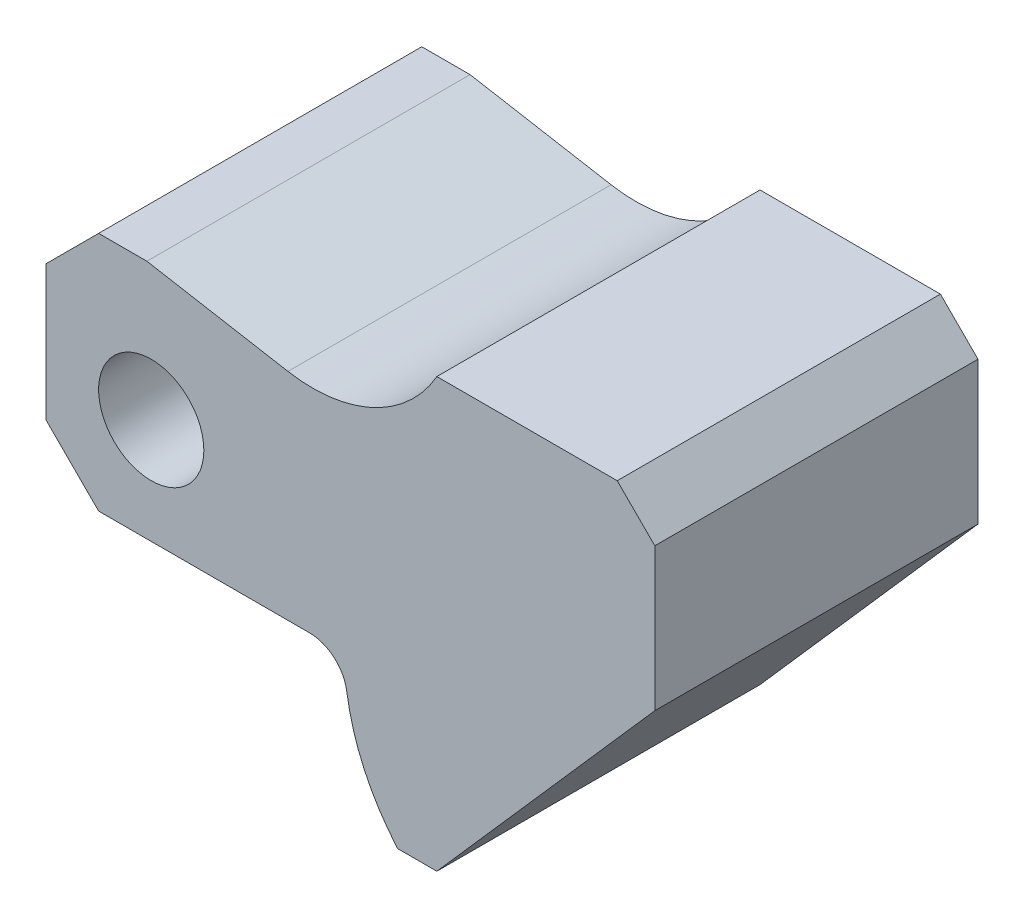
ISO-10303-21;
HEADER;
FILE_DESCRIPTION(('STEP AP214'),'2;1');
FILE_NAME('part.step','',(''),(''),'','','');
FILE_SCHEMA(('AUTOMOTIVE_DESIGN { 1 0 10303 214 1 1 1 1 }'));
ENDSEC;
DATA;
#1=APPLICATION_CONTEXT('core data for automotive mechanical design processes');
#2=APPLICATION_PROTOCOL_DEFINITION('international standard','automotive_design',2000,#1);
#3=PRODUCT_CONTEXT('',#1,'mechanical');
#4=PRODUCT('Part','Part','',(#3));
#5=PRODUCT_RELATED_PRODUCT_CATEGORY('part','',(#4));
#6=PRODUCT_DEFINITION_FORMATION('','',#4);
#7=PRODUCT_DEFINITION_CONTEXT('part definition',#1,'design');
#8=PRODUCT_DEFINITION('design','',#6,#7);
#9=PRODUCT_DEFINITION_SHAPE('','',#8);
#10=(LENGTH_UNIT() NAMED_UNIT(*) SI_UNIT(.MILLI.,.METRE.));
#11=(NAMED_UNIT(*) PLANE_ANGLE_UNIT() SI_UNIT($,.RADIAN.));
#12=(NAMED_UNIT(*) SI_UNIT($,.STERADIAN.) SOLID_ANGLE_UNIT());
#13=UNCERTAINTY_MEASURE_WITH_UNIT(LENGTH_MEASURE(1.E-05),#10,'distance_accuracy_value','');
#14=(GEOMETRIC_REPRESENTATION_CONTEXT(3) GLOBAL_UNCERTAINTY_ASSIGNED_CONTEXT((#13)) GLOBAL_UNIT_ASSIGNED_CONTEXT((#10,
#11,#12)) REPRESENTATION_CONTEXT('',''));
#15=CARTESIAN_POINT('',(0.,0.,0.));
#16=DIRECTION('',(0.,0.,1.));
#17=DIRECTION('',(1.,0.,0.));
#18=AXIS2_PLACEMENT_3D('',#15,#16,#17);
#19=CARTESIAN_POINT('',(28.4894487794159,47.402217737984,43.));
#20=DIRECTION('',(0.,0.,-1.));
#21=DIRECTION('',(-1.,0.,0.));
#22=AXIS2_PLACEMENT_3D('',#19,#20,#21);
#23=PLANE('',#22);
#24=DIRECTION('',(1.,0.,0.));
#25=VECTOR('',#24,1.);
#26=CARTESIAN_POINT('',(28.0666262553694,0.,43.));
#27=LINE('',#26,#25);
#28=CARTESIAN_POINT('',(0.,0.,43.));
#29=VERTEX_POINT('',#28);
#30=CARTESIAN_POINT('',(28.0666262553694,0.,43.));
#31=VERTEX_POINT('',#30);
#32=EDGE_CURVE('E218',#29,#31,#27,.T.);
#33=ORIENTED_EDGE('',*,*,#32,.T.);
#34=CARTESIAN_POINT('',(28.0666262553694,-5.,43.));
#35=DIRECTION('',(0.,0.,-1.));
#36=DIRECTION('',(1.,0.,0.));
#37=AXIS2_PLACEMENT_3D('',#34,#35,#36);
#38=CIRCLE('',#37,5.);
#39=CARTESIAN_POINT('',(33.0122649967811,-4.26470588235295,43.));
#40=VERTEX_POINT('',#39);
#41=EDGE_CURVE('E118',#31,#40,#38,.T.);
#42=ORIENTED_EDGE('',*,*,#41,.T.);
#43=CARTESIAN_POINT('',(61.6969696969699,2.91433543964104E-13,43.));
#44=DIRECTION('',(0.,0.,1.));
#45=DIRECTION('',(-1.,0.,0.));
#46=AXIS2_PLACEMENT_3D('',#43,#44,#45);
#47=CIRCLE('',#46,29.0000000000001);
#48=CARTESIAN_POINT('',(39.788067396763,-18.9999999999997,43.));
#49=VERTEX_POINT('',#48);
#50=EDGE_CURVE('E263',#40,#49,#47,.T.);
#51=ORIENTED_EDGE('',*,*,#50,.T.);
#52=DIRECTION('',(1.,0.,0.));
#53=VECTOR('',#52,1.);
#54=CARTESIAN_POINT('',(45.,-19.,43.));
#55=LINE('',#54,#53);
#56=CARTESIAN_POINT('',(45.,-19.,43.));
#57=VERTEX_POINT('',#56);
#58=EDGE_CURVE('E283',#49,#57,#55,.T.);
#59=ORIENTED_EDGE('',*,*,#58,.T.);
#60=DIRECTION('',(0.660114607728682,0.751164898449873,0.));
#61=VECTOR('',#60,1.);
#62=CARTESIAN_POINT('',(74.,13.9999999999997,43.));
#63=LINE('',#62,#61);
#64=CARTESIAN_POINT('',(74.,13.9999999999997,43.));
#65=VERTEX_POINT('',#64);
#66=EDGE_CURVE('E279',#57,#65,#63,.T.);
#67=ORIENTED_EDGE('',*,*,#66,.T.);
#68=DIRECTION('',(0.,1.,0.));
#69=VECTOR('',#68,1.);
#70=CARTESIAN_POINT('',(74.,32.9999999999997,43.));
#71=LINE('',#70,#69);
#72=CARTESIAN_POINT('',(74.,32.9999999999997,43.));
#73=VERTEX_POINT('',#72);
#74=EDGE_CURVE('E282',#65,#73,#71,.T.);
#75=ORIENTED_EDGE('',*,*,#74,.T.);
#76=DIRECTION('',(-0.707106781186546,0.707106781186549,0.));
#77=VECTOR('',#76,1.);
#78=CARTESIAN_POINT('',(69.,37.9999999999997,43.));
#79=LINE('',#78,#77);
#80=CARTESIAN_POINT('',(69.,37.9999999999997,43.));
#81=VERTEX_POINT('',#80);
#82=EDGE_CURVE('E287',#73,#81,#79,.T.);
#83=ORIENTED_EDGE('',*,*,#82,.T.);
#84=DIRECTION('',(-1.,0.,0.));
#85=VECTOR('',#84,1.);
#86=CARTESIAN_POINT('',(45.,37.9999999999997,43.));
#87=LINE('',#86,#85);
#88=CARTESIAN_POINT('',(45.,37.9999999999997,43.));
#89=VERTEX_POINT('',#88);
#90=EDGE_CURVE('E294',#81,#89,#87,.T.);
#91=ORIENTED_EDGE('',*,*,#90,.T.);
#92=CARTESIAN_POINT('',(28.4894487794159,47.402217737984,43.));
#93=DIRECTION('',(0.,0.,-1.));
#94=DIRECTION('',(-1.,0.,0.));
#95=AXIS2_PLACEMENT_3D('',#92,#93,#94);
#96=CIRCLE('',#95,19.);
#97=CARTESIAN_POINT('',(25.1901334037442,28.6908704307521,43.));
#98=VERTEX_POINT('',#97);
#99=EDGE_CURVE('E297',#89,#98,#96,.T.);
#100=ORIENTED_EDGE('',*,*,#99,.T.);
#101=DIRECTION('',(-0.984807753012208,0.17364817766693,0.));
#102=VECTOR('',#101,1.);
#103=CARTESIAN_POINT('',(6.42312703890897,32.,43.));
#104=LINE('',#103,#102);
#105=CARTESIAN_POINT('',(6.42312703890897,32.,43.));
#106=VERTEX_POINT('',#105);
#107=EDGE_CURVE('E300',#98,#106,#104,.T.);
#108=ORIENTED_EDGE('',*,*,#107,.T.);
#109=DIRECTION('',(-1.,0.,0.));
#110=VECTOR('',#109,1.);
#111=CARTESIAN_POINT('',(0.,32.,43.));
#112=LINE('',#111,#110);
#113=CARTESIAN_POINT('',(0.,32.,43.));
#114=VERTEX_POINT('',#113);
#115=EDGE_CURVE('E155',#106,#114,#112,.T.);
#116=ORIENTED_EDGE('',*,*,#115,.T.);
#117=DIRECTION('',(-0.707106781186546,-0.707106781186549,0.));
#118=VECTOR('',#117,1.);
#119=CARTESIAN_POINT('',(-7.,25.,43.));
#120=LINE('',#119,#118);
#121=CARTESIAN_POINT('',(-7.,25.,43.));
#122=VERTEX_POINT('',#121);
#123=EDGE_CURVE('E149',#114,#122,#120,.T.);
#124=ORIENTED_EDGE('',*,*,#123,.T.);
#125=DIRECTION('',(0.,-1.,0.));
#126=VECTOR('',#125,1.);
#127=CARTESIAN_POINT('',(-7.,6.99999999999997,43.));
#128=LINE('',#127,#126);
#129=CARTESIAN_POINT('',(-7.,6.99999999999997,43.));
#130=VERTEX_POINT('',#129);
#131=EDGE_CURVE('E153',#122,#130,#128,.T.);
#132=ORIENTED_EDGE('',*,*,#131,.T.);
#133=DIRECTION('',(0.707106781186549,-0.707106781186546,0.));
#134=VECTOR('',#133,1.);
#135=CARTESIAN_POINT('',(0.,0.,43.));
#136=LINE('',#135,#134);
#137=EDGE_CURVE('E57',#130,#29,#136,.T.);
#138=ORIENTED_EDGE('',*,*,#137,.T.);
#139=EDGE_LOOP('',(#33,#42,#51,#59,#67,#75,#83,#91,#100,#108,#116,#124,#132,#138));
#140=FACE_BOUND('',#139,.T.);
#141=CARTESIAN_POINT('',(7.,14.,43.));
#142=DIRECTION('',(0.,0.,1.));
#143=DIRECTION('',(1.,0.,0.));
#144=AXIS2_PLACEMENT_3D('',#141,#142,#143);
#145=CIRCLE('',#144,7.);
#146=CARTESIAN_POINT('',(14.,14.,43.));
#147=VERTEX_POINT('',#146);
#148=EDGE_CURVE('E182',#147,#147,#145,.T.);
#149=ORIENTED_EDGE('',*,*,#148,.F.);
#150=EDGE_LOOP('',(#149));
#151=FACE_BOUND('',#150,.T.);
#152=ADVANCED_FACE('F39',(#140,#151),#23,.F.);
#153=CARTESIAN_POINT('',(28.4894487794159,47.402217737984,0.));
#154=DIRECTION('',(0.,0.,-1.));
#155=DIRECTION('',(-1.,0.,0.));
#156=AXIS2_PLACEMENT_3D('',#153,#154,#155);
#157=PLANE('',#156);
#158=DIRECTION('',(1.,0.,0.));
#159=VECTOR('',#158,1.);
#160=CARTESIAN_POINT('',(28.0666262553694,0.,0.));
#161=LINE('',#160,#159);
#162=CARTESIAN_POINT('',(0.,0.,0.));
#163=VERTEX_POINT('',#162);
#164=CARTESIAN_POINT('',(28.0666262553694,0.,0.));
#165=VERTEX_POINT('',#164);
#166=EDGE_CURVE('E177',#163,#165,#161,.T.);
#167=ORIENTED_EDGE('',*,*,#166,.F.);
#168=DIRECTION('',(0.707106781186549,-0.707106781186546,0.));
#169=VECTOR('',#168,1.);
#170=CARTESIAN_POINT('',(0.,0.,0.));
#171=LINE('',#170,#169);
#172=CARTESIAN_POINT('',(-7.,6.99999999999997,0.));
#173=VERTEX_POINT('',#172);
#174=EDGE_CURVE('E110',#173,#163,#171,.T.);
#175=ORIENTED_EDGE('',*,*,#174,.F.);
#176=DIRECTION('',(0.,-1.,0.));
#177=VECTOR('',#176,1.);
#178=CARTESIAN_POINT('',(-7.,6.99999999999997,0.));
#179=LINE('',#178,#177);
#180=CARTESIAN_POINT('',(-7.,25.,0.));
#181=VERTEX_POINT('',#180);
#182=EDGE_CURVE('E104',#181,#173,#179,.T.);
#183=ORIENTED_EDGE('',*,*,#182,.F.);
#184=DIRECTION('',(-0.707106781186546,-0.707106781186549,0.));
#185=VECTOR('',#184,1.);
#186=CARTESIAN_POINT('',(-7.,25.,0.));
#187=LINE('',#186,#185);
#188=CARTESIAN_POINT('',(0.,32.,0.));
#189=VERTEX_POINT('',#188);
#190=EDGE_CURVE('E164',#189,#181,#187,.T.);
#191=ORIENTED_EDGE('',*,*,#190,.F.);
#192=DIRECTION('',(-1.,0.,0.));
#193=VECTOR('',#192,1.);
#194=CARTESIAN_POINT('',(0.,32.,0.));
#195=LINE('',#194,#193);
#196=CARTESIAN_POINT('',(6.42312703890897,32.,0.));
#197=VERTEX_POINT('',#196);
#198=EDGE_CURVE('E209',#197,#189,#195,.T.);
#199=ORIENTED_EDGE('',*,*,#198,.F.);
#200=DIRECTION('',(-0.984807753012208,0.17364817766693,0.));
#201=VECTOR('',#200,1.);
#202=CARTESIAN_POINT('',(6.42312703890897,32.,0.));
#203=LINE('',#202,#201);
#204=CARTESIAN_POINT('',(25.1901334037442,28.6908704307521,0.));
#205=VERTEX_POINT('',#204);
#206=EDGE_CURVE('E206',#205,#197,#203,.T.);
#207=ORIENTED_EDGE('',*,*,#206,.F.);
#208=CARTESIAN_POINT('',(28.4894487794159,47.402217737984,0.));
#209=DIRECTION('',(0.,0.,-1.));
#210=DIRECTION('',(-1.,0.,0.));
#211=AXIS2_PLACEMENT_3D('',#208,#209,#210);
#212=CIRCLE('',#211,19.);
#213=CARTESIAN_POINT('',(45.,37.9999999999997,0.));
#214=VERTEX_POINT('',#213);
#215=EDGE_CURVE('E203',#214,#205,#212,.T.);
#216=ORIENTED_EDGE('',*,*,#215,.F.);
#217=DIRECTION('',(-1.,0.,0.));
#218=VECTOR('',#217,1.);
#219=CARTESIAN_POINT('',(45.,37.9999999999997,0.));
#220=LINE('',#219,#218);
#221=CARTESIAN_POINT('',(69.,37.9999999999997,0.));
#222=VERTEX_POINT('',#221);
#223=EDGE_CURVE('E200',#222,#214,#220,.T.);
#224=ORIENTED_EDGE('',*,*,#223,.F.);
#225=DIRECTION('',(-0.707106781186546,0.707106781186549,0.));
#226=VECTOR('',#225,1.);
#227=CARTESIAN_POINT('',(69.,37.9999999999997,0.));
#228=LINE('',#227,#226);
#229=CARTESIAN_POINT('',(74.,32.9999999999997,0.));
#230=VERTEX_POINT('',#229);
#231=EDGE_CURVE('E197',#230,#222,#228,.T.);
#232=ORIENTED_EDGE('',*,*,#231,.F.);
#233=DIRECTION('',(0.,1.,0.));
#234=VECTOR('',#233,1.);
#235=CARTESIAN_POINT('',(74.,32.9999999999997,0.));
#236=LINE('',#235,#234);
#237=CARTESIAN_POINT('',(74.,13.9999999999997,0.));
#238=VERTEX_POINT('',#237);
#239=EDGE_CURVE('E194',#238,#230,#236,.T.);
#240=ORIENTED_EDGE('',*,*,#239,.F.);
#241=DIRECTION('',(0.660114607728682,0.751164898449873,0.));
#242=VECTOR('',#241,1.);
#243=CARTESIAN_POINT('',(74.,13.9999999999997,0.));
#244=LINE('',#243,#242);
#245=CARTESIAN_POINT('',(45.,-19.,0.));
#246=VERTEX_POINT('',#245);
#247=EDGE_CURVE('E191',#246,#238,#244,.T.);
#248=ORIENTED_EDGE('',*,*,#247,.F.);
#249=DIRECTION('',(1.,0.,0.));
#250=VECTOR('',#249,1.);
#251=CARTESIAN_POINT('',(45.,-19.,0.));
#252=LINE('',#251,#250);
#253=CARTESIAN_POINT('',(39.788067396763,-18.9999999999997,0.));
#254=VERTEX_POINT('',#253);
#255=EDGE_CURVE('E188',#254,#246,#252,.T.);
#256=ORIENTED_EDGE('',*,*,#255,.F.);
#257=CARTESIAN_POINT('',(61.6969696969699,2.91433543964104E-13,0.));
#258=DIRECTION('',(0.,0.,1.));
#259=DIRECTION('',(-1.,0.,0.));
#260=AXIS2_PLACEMENT_3D('',#257,#258,#259);
#261=CIRCLE('',#260,29.0000000000001);
#262=CARTESIAN_POINT('',(33.0122649967811,-4.26470588235295,0.));
#263=VERTEX_POINT('',#262);
#264=EDGE_CURVE('E185',#263,#254,#261,.T.);
#265=ORIENTED_EDGE('',*,*,#264,.F.);
#266=CARTESIAN_POINT('',(28.0666262553694,-5.,0.));
#267=DIRECTION('',(0.,0.,-1.));
#268=DIRECTION('',(1.,0.,0.));
#269=AXIS2_PLACEMENT_3D('',#266,#267,#268);
#270=CIRCLE('',#269,5.);
#271=EDGE_CURVE('E181',#165,#263,#270,.T.);
#272=ORIENTED_EDGE('',*,*,#271,.F.);
#273=EDGE_LOOP('',(#167,#175,#183,#191,#199,#207,#216,#224,#232,#240,#248,#256,#265,#272));
#274=FACE_BOUND('',#273,.T.);
#275=CARTESIAN_POINT('',(7.,14.,0.));
#276=DIRECTION('',(0.,0.,1.));
#277=DIRECTION('',(1.,0.,0.));
#278=AXIS2_PLACEMENT_3D('',#275,#276,#277);
#279=CIRCLE('',#278,7.);
#280=CARTESIAN_POINT('',(14.,14.,0.));
#281=VERTEX_POINT('',#280);
#282=EDGE_CURVE('E475',#281,#281,#279,.T.);
#283=ORIENTED_EDGE('',*,*,#282,.T.);
#284=EDGE_LOOP('',(#283));
#285=FACE_BOUND('',#284,.T.);
#286=ADVANCED_FACE('F267',(#274,#285),#157,.T.);
#287=CARTESIAN_POINT('',(28.0666262553694,0.,43.));
#288=DIRECTION('',(0.,1.,0.));
#289=DIRECTION('',(0.,0.,1.));
#290=AXIS2_PLACEMENT_3D('',#287,#288,#289);
#291=PLANE('',#290);
#292=ORIENTED_EDGE('',*,*,#166,.T.);
#293=DIRECTION('',(0.,0.,-1.));
#294=VECTOR('',#293,1.);
#295=CARTESIAN_POINT('',(28.0666262553694,0.,43.));
#296=LINE('',#295,#294);
#297=EDGE_CURVE('E11',#31,#165,#296,.T.);
#298=ORIENTED_EDGE('',*,*,#297,.F.);
#299=ORIENTED_EDGE('',*,*,#32,.F.);
#300=DIRECTION('',(0.,0.,-1.));
#301=VECTOR('',#300,1.);
#302=CARTESIAN_POINT('',(0.,0.,43.));
#303=LINE('',#302,#301);
#304=EDGE_CURVE('E173',#29,#163,#303,.T.);
#305=ORIENTED_EDGE('',*,*,#304,.T.);
#306=EDGE_LOOP('',(#292,#298,#299,#305));
#307=FACE_BOUND('',#306,.T.);
#308=ADVANCED_FACE('F41',(#307),#291,.F.);
#309=CARTESIAN_POINT('',(28.0666262553694,-5.,43.));
#310=DIRECTION('',(0.,0.,-1.));
#311=DIRECTION('',(-1.,0.,0.));
#312=AXIS2_PLACEMENT_3D('',#309,#310,#311);
#313=CYLINDRICAL_SURFACE('',#312,5.);
#314=ORIENTED_EDGE('',*,*,#271,.T.);
#315=DIRECTION('',(0.,0.,-1.));
#316=VECTOR('',#315,1.);
#317=CARTESIAN_POINT('',(33.0122649967811,-4.26470588235295,43.));
#318=LINE('',#317,#316);
#319=EDGE_CURVE('E49',#40,#263,#318,.T.);
#320=ORIENTED_EDGE('',*,*,#319,.F.);
#321=ORIENTED_EDGE('',*,*,#41,.F.);
#322=ORIENTED_EDGE('',*,*,#297,.T.);
#323=EDGE_LOOP('',(#314,#320,#321,#322));
#324=FACE_BOUND('',#323,.T.);
#325=ADVANCED_FACE('F336',(#324),#313,.F.);
#326=CARTESIAN_POINT('',(61.6969696969699,2.91433543964104E-13,43.));
#327=DIRECTION('',(0.,0.,-1.));
#328=DIRECTION('',(-1.,0.,0.));
#329=AXIS2_PLACEMENT_3D('',#326,#327,#328);
#330=CYLINDRICAL_SURFACE('',#329,29.0000000000001);
#331=ORIENTED_EDGE('',*,*,#264,.T.);
#332=DIRECTION('',(0.,0.,-1.));
#333=VECTOR('',#332,1.);
#334=CARTESIAN_POINT('',(39.788067396763,-18.9999999999997,43.));
#335=LINE('',#334,#333);
#336=EDGE_CURVE('E253',#49,#254,#335,.T.);
#337=ORIENTED_EDGE('',*,*,#336,.F.);
#338=ORIENTED_EDGE('',*,*,#50,.F.);
#339=ORIENTED_EDGE('',*,*,#319,.T.);
#340=EDGE_LOOP('',(#331,#337,#338,#339));
#341=FACE_BOUND('',#340,.T.);
#342=ADVANCED_FACE('F261',(#341),#330,.T.);
#343=CARTESIAN_POINT('',(45.,-19.,43.));
#344=DIRECTION('',(0.,1.,0.));
#345=DIRECTION('',(-1.,0.,0.));
#346=AXIS2_PLACEMENT_3D('',#343,#344,#345);
#347=PLANE('',#346);
#348=ORIENTED_EDGE('',*,*,#255,.T.);
#349=DIRECTION('',(0.,0.,-1.));
#350=VECTOR('',#349,1.);
#351=CARTESIAN_POINT('',(45.,-19.,43.));
#352=LINE('',#351,#350);
#353=EDGE_CURVE('E249',#57,#246,#352,.T.);
#354=ORIENTED_EDGE('',*,*,#353,.F.);
#355=ORIENTED_EDGE('',*,*,#58,.F.);
#356=ORIENTED_EDGE('',*,*,#336,.T.);
#357=EDGE_LOOP('',(#348,#354,#355,#356));
#358=FACE_BOUND('',#357,.T.);
#359=ADVANCED_FACE('F273',(#358),#347,.F.);
#360=CARTESIAN_POINT('',(74.,13.9999999999997,43.));
#361=DIRECTION('',(-0.751164898449873,0.660114607728682,0.));
#362=DIRECTION('',(-0.660114607728682,-0.751164898449873,0.));
#363=AXIS2_PLACEMENT_3D('',#360,#361,#362);
#364=PLANE('',#363);
#365=ORIENTED_EDGE('',*,*,#247,.T.);
#366=DIRECTION('',(0.,0.,-1.));
#367=VECTOR('',#366,1.);
#368=CARTESIAN_POINT('',(74.,13.9999999999997,43.));
#369=LINE('',#368,#367);
#370=EDGE_CURVE('E245',#65,#238,#369,.T.);
#371=ORIENTED_EDGE('',*,*,#370,.F.);
#372=ORIENTED_EDGE('',*,*,#66,.F.);
#373=ORIENTED_EDGE('',*,*,#353,.T.);
#374=EDGE_LOOP('',(#365,#371,#372,#373));
#375=FACE_BOUND('',#374,.T.);
#376=ADVANCED_FACE('F277',(#375),#364,.F.);
#377=CARTESIAN_POINT('',(74.,32.9999999999997,43.));
#378=DIRECTION('',(-1.,0.,0.));
#379=DIRECTION('',(0.,0.,1.));
#380=AXIS2_PLACEMENT_3D('',#377,#378,#379);
#381=PLANE('',#380);
#382=ORIENTED_EDGE('',*,*,#239,.T.);
#383=DIRECTION('',(0.,0.,-1.));
#384=VECTOR('',#383,1.);
#385=CARTESIAN_POINT('',(74.,32.9999999999997,43.));
#386=LINE('',#385,#384);
#387=EDGE_CURVE('E241',#73,#230,#386,.T.);
#388=ORIENTED_EDGE('',*,*,#387,.F.);
#389=ORIENTED_EDGE('',*,*,#74,.F.);
#390=ORIENTED_EDGE('',*,*,#370,.T.);
#391=EDGE_LOOP('',(#382,#388,#389,#390));
#392=FACE_BOUND('',#391,.T.);
#393=ADVANCED_FACE('F349',(#392),#381,.F.);
#394=CARTESIAN_POINT('',(69.,37.9999999999997,43.));
#395=DIRECTION('',(-0.707106781186549,-0.707106781186546,0.));
#396=DIRECTION('',(0.707106781186546,-0.707106781186549,0.));
#397=AXIS2_PLACEMENT_3D('',#394,#395,#396);
#398=PLANE('',#397);
#399=ORIENTED_EDGE('',*,*,#231,.T.);
#400=DIRECTION('',(0.,0.,-1.));
#401=VECTOR('',#400,1.);
#402=CARTESIAN_POINT('',(69.,37.9999999999997,43.));
#403=LINE('',#402,#401);
#404=EDGE_CURVE('E237',#81,#222,#403,.T.);
#405=ORIENTED_EDGE('',*,*,#404,.F.);
#406=ORIENTED_EDGE('',*,*,#82,.F.);
#407=ORIENTED_EDGE('',*,*,#387,.T.);
#408=EDGE_LOOP('',(#399,#405,#406,#407));
#409=FACE_BOUND('',#408,.T.);
#410=ADVANCED_FACE('F352',(#409),#398,.F.);
#411=CARTESIAN_POINT('',(45.,37.9999999999997,43.));
#412=DIRECTION('',(0.,-1.,0.));
#413=DIRECTION('',(1.,0.,0.));
#414=AXIS2_PLACEMENT_3D('',#411,#412,#413);
#415=PLANE('',#414);
#416=ORIENTED_EDGE('',*,*,#223,.T.);
#417=DIRECTION('',(0.,0.,-1.));
#418=VECTOR('',#417,1.);
#419=CARTESIAN_POINT('',(45.,37.9999999999997,43.));
#420=LINE('',#419,#418);
#421=EDGE_CURVE('E233',#89,#214,#420,.T.);
#422=ORIENTED_EDGE('',*,*,#421,.F.);
#423=ORIENTED_EDGE('',*,*,#90,.F.);
#424=ORIENTED_EDGE('',*,*,#404,.T.);
#425=EDGE_LOOP('',(#416,#422,#423,#424));
#426=FACE_BOUND('',#425,.T.);
#427=ADVANCED_FACE('F356',(#426),#415,.F.);
#428=CARTESIAN_POINT('',(28.4894487794159,47.402217737984,43.));
#429=DIRECTION('',(0.,0.,-1.));
#430=DIRECTION('',(-1.,0.,0.));
#431=AXIS2_PLACEMENT_3D('',#428,#429,#430);
#432=CYLINDRICAL_SURFACE('',#431,19.);
#433=ORIENTED_EDGE('',*,*,#215,.T.);
#434=DIRECTION('',(0.,0.,-1.));
#435=VECTOR('',#434,1.);
#436=CARTESIAN_POINT('',(25.1901334037442,28.6908704307521,43.));
#437=LINE('',#436,#435);
#438=EDGE_CURVE('E229',#98,#205,#437,.T.);
#439=ORIENTED_EDGE('',*,*,#438,.F.);
#440=ORIENTED_EDGE('',*,*,#99,.F.);
#441=ORIENTED_EDGE('',*,*,#421,.T.);
#442=EDGE_LOOP('',(#433,#439,#440,#441));
#443=FACE_BOUND('',#442,.T.);
#444=ADVANCED_FACE('F360',(#443),#432,.F.);
#445=CARTESIAN_POINT('',(6.42312703890897,32.,43.));
#446=DIRECTION('',(-0.17364817766693,-0.984807753012208,0.));
#447=DIRECTION('',(0.984807753012208,-0.17364817766693,0.));
#448=AXIS2_PLACEMENT_3D('',#445,#446,#447);
#449=PLANE('',#448);
#450=ORIENTED_EDGE('',*,*,#206,.T.);
#451=DIRECTION('',(0.,0.,-1.));
#452=VECTOR('',#451,1.);
#453=CARTESIAN_POINT('',(6.42312703890897,32.,43.));
#454=LINE('',#453,#452);
#455=EDGE_CURVE('E225',#106,#197,#454,.T.);
#456=ORIENTED_EDGE('',*,*,#455,.F.);
#457=ORIENTED_EDGE('',*,*,#107,.F.);
#458=ORIENTED_EDGE('',*,*,#438,.T.);
#459=EDGE_LOOP('',(#450,#456,#457,#458));
#460=FACE_BOUND('',#459,.T.);
#461=ADVANCED_FACE('F308',(#460),#449,.F.);
#462=CARTESIAN_POINT('',(0.,32.,43.));
#463=DIRECTION('',(0.,-1.,0.));
#464=DIRECTION('',(0.,0.,-1.));
#465=AXIS2_PLACEMENT_3D('',#462,#463,#464);
#466=PLANE('',#465);
#467=ORIENTED_EDGE('',*,*,#198,.T.);
#468=DIRECTION('',(0.,0.,-1.));
#469=VECTOR('',#468,1.);
#470=CARTESIAN_POINT('',(0.,32.,43.));
#471=LINE('',#470,#469);
#472=EDGE_CURVE('E166',#114,#189,#471,.T.);
#473=ORIENTED_EDGE('',*,*,#472,.F.);
#474=ORIENTED_EDGE('',*,*,#115,.F.);
#475=ORIENTED_EDGE('',*,*,#455,.T.);
#476=EDGE_LOOP('',(#467,#473,#474,#475));
#477=FACE_BOUND('',#476,.T.);
#478=ADVANCED_FACE('F312',(#477),#466,.F.);
#479=CARTESIAN_POINT('',(-7.,25.,43.));
#480=DIRECTION('',(0.707106781186549,-0.707106781186546,0.));
#481=DIRECTION('',(0.707106781186546,0.707106781186549,0.));
#482=AXIS2_PLACEMENT_3D('',#479,#480,#481);
#483=PLANE('',#482);
#484=ORIENTED_EDGE('',*,*,#190,.T.);
#485=DIRECTION('',(0.,0.,-1.));
#486=VECTOR('',#485,1.);
#487=CARTESIAN_POINT('',(-7.,25.,43.));
#488=LINE('',#487,#486);
#489=EDGE_CURVE('E161',#122,#181,#488,.T.);
#490=ORIENTED_EDGE('',*,*,#489,.F.);
#491=ORIENTED_EDGE('',*,*,#123,.F.);
#492=ORIENTED_EDGE('',*,*,#472,.T.);
#493=EDGE_LOOP('',(#484,#490,#491,#492));
#494=FACE_BOUND('',#493,.T.);
#495=ADVANCED_FACE('F162',(#494),#483,.F.);
#496=CARTESIAN_POINT('',(-7.,6.99999999999997,43.));
#497=DIRECTION('',(1.,0.,0.));
#498=DIRECTION('',(0.,1.,0.));
#499=AXIS2_PLACEMENT_3D('',#496,#497,#498);
#500=PLANE('',#499);
#501=ORIENTED_EDGE('',*,*,#182,.T.);
#502=DIRECTION('',(0.,0.,-1.));
#503=VECTOR('',#502,1.);
#504=CARTESIAN_POINT('',(-7.,6.99999999999997,43.));
#505=LINE('',#504,#503);
#506=EDGE_CURVE('E167',#130,#173,#505,.T.);
#507=ORIENTED_EDGE('',*,*,#506,.F.);
#508=ORIENTED_EDGE('',*,*,#131,.F.);
#509=ORIENTED_EDGE('',*,*,#489,.T.);
#510=EDGE_LOOP('',(#501,#507,#508,#509));
#511=FACE_BOUND('',#510,.T.);
#512=ADVANCED_FACE('F169',(#511),#500,.F.);
#513=CARTESIAN_POINT('',(0.,0.,43.));
#514=DIRECTION('',(0.707106781186546,0.707106781186549,0.));
#515=DIRECTION('',(-0.707106781186549,0.707106781186546,0.));
#516=AXIS2_PLACEMENT_3D('',#513,#514,#515);
#517=PLANE('',#516);
#518=ORIENTED_EDGE('',*,*,#174,.T.);
#519=ORIENTED_EDGE('',*,*,#304,.F.);
#520=ORIENTED_EDGE('',*,*,#137,.F.);
#521=ORIENTED_EDGE('',*,*,#506,.T.);
#522=EDGE_LOOP('',(#518,#519,#520,#521));
#523=FACE_BOUND('',#522,.T.);
#524=ADVANCED_FACE('F316',(#523),#517,.F.);
#525=CARTESIAN_POINT('',(7.,14.,43.));
#526=DIRECTION('',(0.,0.,-1.));
#527=DIRECTION('',(-1.,0.,0.));
#528=AXIS2_PLACEMENT_3D('',#525,#526,#527);
#529=CYLINDRICAL_SURFACE('',#528,7.);
#530=ORIENTED_EDGE('',*,*,#148,.T.);
#531=EDGE_LOOP('',(#530));
#532=FACE_BOUND('',#531,.T.);
#533=ORIENTED_EDGE('',*,*,#282,.F.);
#534=EDGE_LOOP('',(#533));
#535=FACE_BOUND('',#534,.T.);
#536=ADVANCED_FACE('F318',(#532,#535),#529,.F.);
#537=CLOSED_SHELL('',(#152,#286,#308,#325,#342,#359,#376,#393,#410,#427,#444,#461,#478,#495,
#512,#524,#536));
#538=MANIFOLD_SOLID_BREP('B2',#537);
#539=ADVANCED_BREP_SHAPE_REPRESENTATION('',(#18,#538),#14);
#540=SHAPE_DEFINITION_REPRESENTATION(#9,#539);
ENDSEC;
END-ISO-10303-21;
